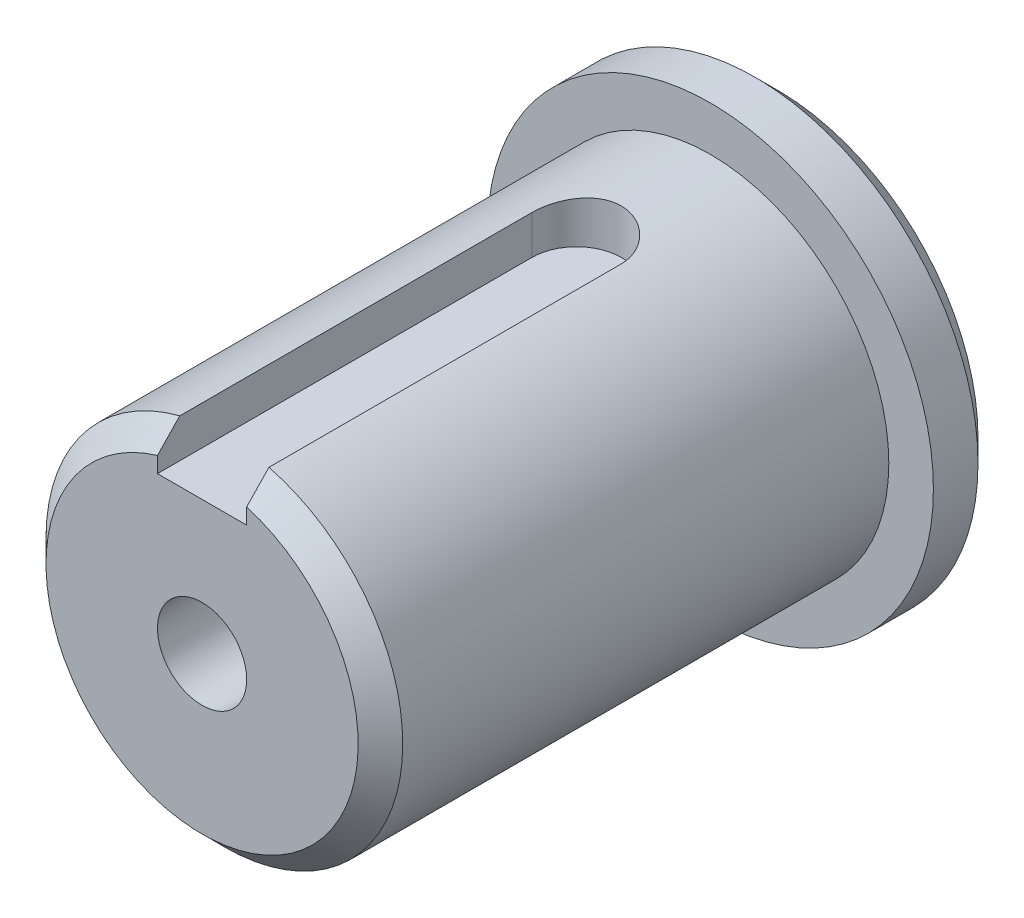
ISO-10303-21;
HEADER;
FILE_DESCRIPTION(('STEP AP214'),'2;1');
FILE_NAME('part.step','',(''),(''),'','','');
FILE_SCHEMA(('AUTOMOTIVE_DESIGN { 1 0 10303 214 1 1 1 1 }'));
ENDSEC;
DATA;
#1=APPLICATION_CONTEXT('core data for automotive mechanical design processes');
#2=APPLICATION_PROTOCOL_DEFINITION('international standard','automotive_design',2000,#1);
#3=PRODUCT_CONTEXT('',#1,'mechanical');
#4=PRODUCT('Part','Part','',(#3));
#5=PRODUCT_RELATED_PRODUCT_CATEGORY('part','',(#4));
#6=PRODUCT_DEFINITION_FORMATION('','',#4);
#7=PRODUCT_DEFINITION_CONTEXT('part definition',#1,'design');
#8=PRODUCT_DEFINITION('design','',#6,#7);
#9=PRODUCT_DEFINITION_SHAPE('','',#8);
#10=(LENGTH_UNIT() NAMED_UNIT(*) SI_UNIT(.MILLI.,.METRE.));
#11=(NAMED_UNIT(*) PLANE_ANGLE_UNIT() SI_UNIT($,.RADIAN.));
#12=(NAMED_UNIT(*) SI_UNIT($,.STERADIAN.) SOLID_ANGLE_UNIT());
#13=UNCERTAINTY_MEASURE_WITH_UNIT(LENGTH_MEASURE(1.E-05),#10,'distance_accuracy_value','');
#14=(GEOMETRIC_REPRESENTATION_CONTEXT(3) GLOBAL_UNCERTAINTY_ASSIGNED_CONTEXT((#13)) GLOBAL_UNIT_ASSIGNED_CONTEXT((#10,
#11,#12)) REPRESENTATION_CONTEXT('',''));
#15=CARTESIAN_POINT('',(0.,0.,0.));
#16=DIRECTION('',(0.,0.,1.));
#17=DIRECTION('',(1.,0.,0.));
#18=AXIS2_PLACEMENT_3D('',#15,#16,#17);
#19=CARTESIAN_POINT('',(0.,0.,0.));
#20=DIRECTION('',(0.,0.,1.));
#21=DIRECTION('',(1.,0.,0.));
#22=AXIS2_PLACEMENT_3D('',#19,#20,#21);
#23=CYLINDRICAL_SURFACE('',#22,2.5);
#24=CARTESIAN_POINT('',(0.,0.,0.));
#25=DIRECTION('',(0.,0.,1.));
#26=DIRECTION('',(1.,0.,0.));
#27=AXIS2_PLACEMENT_3D('',#24,#25,#26);
#28=CIRCLE('',#27,2.5);
#29=CARTESIAN_POINT('',(2.5,0.,0.));
#30=VERTEX_POINT('',#29);
#31=EDGE_CURVE('E110',#30,#30,#28,.T.);
#32=ORIENTED_EDGE('',*,*,#31,.F.);
#33=EDGE_LOOP('',(#32));
#34=FACE_BOUND('',#33,.T.);
#35=CARTESIAN_POINT('',(0.,0.,8.));
#36=DIRECTION('',(0.,0.,1.));
#37=DIRECTION('',(1.,0.,0.));
#38=AXIS2_PLACEMENT_3D('',#35,#36,#37);
#39=CIRCLE('',#38,2.5);
#40=CARTESIAN_POINT('',(2.5,0.,8.));
#41=VERTEX_POINT('',#40);
#42=EDGE_CURVE('E183',#41,#41,#39,.T.);
#43=ORIENTED_EDGE('',*,*,#42,.T.);
#44=EDGE_LOOP('',(#43));
#45=FACE_BOUND('',#44,.T.);
#46=ADVANCED_FACE('F45',(#34,#45),#23,.F.);
#47=CARTESIAN_POINT('',(0.,2.5,0.));
#48=DIRECTION('',(0.,0.,1.));
#49=DIRECTION('',(1.,0.,0.));
#50=AXIS2_PLACEMENT_3D('',#47,#48,#49);
#51=PLANE('',#50);
#52=CARTESIAN_POINT('',(0.,0.,0.));
#53=DIRECTION('',(0.,0.,1.));
#54=DIRECTION('',(1.,0.,0.));
#55=AXIS2_PLACEMENT_3D('',#52,#53,#54);
#56=CIRCLE('',#55,4.5);
#57=CARTESIAN_POINT('',(4.5,0.,0.));
#58=VERTEX_POINT('',#57);
#59=EDGE_CURVE('E211',#58,#58,#56,.T.);
#60=ORIENTED_EDGE('',*,*,#59,.F.);
#61=EDGE_LOOP('',(#60));
#62=FACE_BOUND('',#61,.T.);
#63=ORIENTED_EDGE('',*,*,#31,.T.);
#64=EDGE_LOOP('',(#63));
#65=FACE_BOUND('',#64,.T.);
#66=ADVANCED_FACE('F171',(#62,#65),#51,.F.);
#67=CARTESIAN_POINT('',(0.,0.,0.));
#68=DIRECTION('',(0.,0.,1.));
#69=DIRECTION('',(1.,0.,0.));
#70=AXIS2_PLACEMENT_3D('',#67,#68,#69);
#71=CONICAL_SURFACE('',#70,4.5,0.785398163397446);
#72=CARTESIAN_POINT('',(0.,0.,0.500000000000002));
#73=DIRECTION('',(0.,0.,1.));
#74=DIRECTION('',(1.,0.,0.));
#75=AXIS2_PLACEMENT_3D('',#72,#73,#74);
#76=CIRCLE('',#75,5.);
#77=CARTESIAN_POINT('',(5.,0.,0.500000000000002));
#78=VERTEX_POINT('',#77);
#79=EDGE_CURVE('E208',#78,#78,#76,.T.);
#80=ORIENTED_EDGE('',*,*,#79,.F.);
#81=EDGE_LOOP('',(#80));
#82=FACE_BOUND('',#81,.T.);
#83=ORIENTED_EDGE('',*,*,#59,.T.);
#84=EDGE_LOOP('',(#83));
#85=FACE_BOUND('',#84,.T.);
#86=ADVANCED_FACE('F176',(#82,#85),#71,.T.);
#87=CARTESIAN_POINT('',(0.,0.,0.));
#88=DIRECTION('',(0.,0.,1.));
#89=DIRECTION('',(1.,0.,0.));
#90=AXIS2_PLACEMENT_3D('',#87,#88,#89);
#91=CYLINDRICAL_SURFACE('',#90,5.);
#92=CARTESIAN_POINT('',(0.,0.,1.5));
#93=DIRECTION('',(0.,0.,1.));
#94=DIRECTION('',(1.,0.,0.));
#95=AXIS2_PLACEMENT_3D('',#92,#93,#94);
#96=CIRCLE('',#95,5.);
#97=CARTESIAN_POINT('',(5.,0.,1.5));
#98=VERTEX_POINT('',#97);
#99=EDGE_CURVE('E205',#98,#98,#96,.T.);
#100=ORIENTED_EDGE('',*,*,#99,.F.);
#101=EDGE_LOOP('',(#100));
#102=FACE_BOUND('',#101,.T.);
#103=ORIENTED_EDGE('',*,*,#79,.T.);
#104=EDGE_LOOP('',(#103));
#105=FACE_BOUND('',#104,.T.);
#106=ADVANCED_FACE('F218',(#102,#105),#91,.T.);
#107=CARTESIAN_POINT('',(0.,5.,1.5));
#108=DIRECTION('',(0.,0.,-1.));
#109=DIRECTION('',(-1.,0.,0.));
#110=AXIS2_PLACEMENT_3D('',#107,#108,#109);
#111=PLANE('',#110);
#112=CARTESIAN_POINT('',(0.,0.,1.5));
#113=DIRECTION('',(0.,0.,1.));
#114=DIRECTION('',(1.,0.,0.));
#115=AXIS2_PLACEMENT_3D('',#112,#113,#114);
#116=CIRCLE('',#115,4.);
#117=CARTESIAN_POINT('',(4.,0.,1.5));
#118=VERTEX_POINT('',#117);
#119=EDGE_CURVE('E202',#118,#118,#116,.T.);
#120=ORIENTED_EDGE('',*,*,#119,.F.);
#121=EDGE_LOOP('',(#120));
#122=FACE_BOUND('',#121,.T.);
#123=ORIENTED_EDGE('',*,*,#99,.T.);
#124=EDGE_LOOP('',(#123));
#125=FACE_BOUND('',#124,.T.);
#126=ADVANCED_FACE('F224',(#122,#125),#111,.F.);
#127=CARTESIAN_POINT('',(0.,0.,0.));
#128=DIRECTION('',(0.,0.,1.));
#129=DIRECTION('',(1.,0.,0.));
#130=AXIS2_PLACEMENT_3D('',#127,#128,#129);
#131=CYLINDRICAL_SURFACE('',#130,4.);
#132=CARTESIAN_POINT('',(0.,0.,12.4));
#133=DIRECTION('',(0.,0.,1.));
#134=DIRECTION('',(1.,0.,0.));
#135=AXIS2_PLACEMENT_3D('',#132,#133,#134);
#136=CIRCLE('',#135,4.);
#137=CARTESIAN_POINT('',(-1.,3.87298334620742,12.4));
#138=VERTEX_POINT('',#137);
#139=CARTESIAN_POINT('',(1.,3.87298334620742,12.4));
#140=VERTEX_POINT('',#139);
#141=EDGE_CURVE('E198',#138,#140,#136,.T.);
#142=ORIENTED_EDGE('',*,*,#141,.F.);
#143=DIRECTION('',(0.,0.,1.));
#144=VECTOR('',#143,1.);
#145=CARTESIAN_POINT('',(-1.,3.87298334620742,0.));
#146=LINE('',#145,#144);
#147=CARTESIAN_POINT('',(-1.,3.87298334620742,4.5));
#148=VERTEX_POINT('',#147);
#149=EDGE_CURVE('E74',#138,#148,#146,.F.);
#150=ORIENTED_EDGE('',*,*,#149,.T.);
#151=CARTESIAN_POINT('',(-1.,3.87298334620742,4.5));
#152=CARTESIAN_POINT('',(-1.00000033749611,3.87298148580177,4.47233701489346));
#153=CARTESIAN_POINT('',(-0.998851407375366,3.87328009949471,4.44468773698177));
#154=CARTESIAN_POINT('',(-0.994271295395754,3.87445904774559,4.38959596469644));
#155=CARTESIAN_POINT('',(-0.990840497572679,3.87533928441687,4.36215343631291));
#156=CARTESIAN_POINT('',(-0.977175239382526,3.87881710972054,4.28054682679115));
#157=CARTESIAN_POINT('',(-0.963567695172493,3.88225203148809,4.22694353151779));
#158=CARTESIAN_POINT('',(-0.927798076247996,3.89095422588003,4.12287532621803));
#159=CARTESIAN_POINT('',(-0.905636805423835,3.8962213263093,4.07241012178714));
#160=CARTESIAN_POINT('',(-0.853415378025865,3.90799134471939,3.97588855135267));
#161=CARTESIAN_POINT('',(-0.823353103356932,3.91449459395647,3.92983337210903));
#162=CARTESIAN_POINT('',(-0.755484471828068,3.92816262398025,3.8424561180939));
#163=CARTESIAN_POINT('',(-0.717537268783975,3.93533791028916,3.80124511375448));
#164=CARTESIAN_POINT('',(-0.635275780516229,3.94945104396193,3.72569791051729));
#165=CARTESIAN_POINT('',(-0.590960479478831,3.95638885322537,3.69136281053206));
#166=CARTESIAN_POINT('',(-0.49645689940169,3.96936182283248,3.63008899838135));
#167=CARTESIAN_POINT('',(-0.446195340334473,3.9753830468173,3.60326010401602));
#168=CARTESIAN_POINT('',(-0.341702590842918,3.98572346250589,3.55847526580329));
#169=CARTESIAN_POINT('',(-0.287472184083009,3.99004298914701,3.54051757570017));
#170=CARTESIAN_POINT('',(-0.17774410852516,3.99641900005128,3.51434100722257));
#171=CARTESIAN_POINT('',(-0.122294322002857,3.99851952901301,3.50593232757718));
#172=CARTESIAN_POINT('',(-0.010732775681679,4.00037438150815,3.4984966284567));
#173=CARTESIAN_POINT('',(0.0453789000287061,4.00012899993445,3.49946842980766));
#174=CARTESIAN_POINT('',(0.155352492972096,3.99735237365736,3.51062996368545));
#175=CARTESIAN_POINT('',(0.209236701739855,3.99487198677361,3.52061461659948));
#176=CARTESIAN_POINT('',(0.31453871108434,3.98796330636496,3.54918867918275));
#177=CARTESIAN_POINT('',(0.365956402423988,3.98353492665556,3.56777846956858));
#178=CARTESIAN_POINT('',(0.465407286024539,3.97314997761798,3.61320128067065));
#179=CARTESIAN_POINT('',(0.513405629602249,3.96717993827555,3.64010739423284));
#180=CARTESIAN_POINT('',(0.604276631230014,3.95435945541919,3.70134312983347));
#181=CARTESIAN_POINT('',(0.647148515562289,3.94750887933198,3.73567387025322));
#182=CARTESIAN_POINT('',(0.72776938970849,3.93345566022865,3.81187891208131));
#183=CARTESIAN_POINT('',(0.765349103054127,3.92624850477685,3.85393163653981));
#184=CARTESIAN_POINT('',(0.832969575186237,3.91246168284006,3.94382986692773));
#185=CARTESIAN_POINT('',(0.863008270245062,3.90588218842993,3.99167695328356));
#186=CARTESIAN_POINT('',(0.914804709285961,3.89407813586325,4.09214559782377));
#187=CARTESIAN_POINT('',(0.936517017887269,3.88886106009137,4.14479146489608));
#188=CARTESIAN_POINT('',(0.970702351849828,3.88047058807055,4.25311692841828));
#189=CARTESIAN_POINT('',(0.983189189212131,3.87729413761435,4.30879185514984));
#190=CARTESIAN_POINT('',(0.993904635150937,3.87455290681524,4.3874573807589));
#191=CARTESIAN_POINT('',(0.996190790966708,3.8739652311086,4.40991970321318));
#192=CARTESIAN_POINT('',(0.999236757697393,3.87318062488974,4.45491778990932));
#193=CARTESIAN_POINT('',(0.999999038096045,3.87298306219461,4.47745337595529));
#194=CARTESIAN_POINT('',(1.,3.87298334620742,4.5));
#195=B_SPLINE_CURVE_WITH_KNOTS('',3,(#151,#152,#153,#154,#155,#156,#157,#158,#159,#160,#161,
#162,#163,#164,#165,#166,#167,#168,#169,#170,#171,#172,#173,#174,#175,#176,#177,#178,#179,#180,
#181,#182,#183,#184,#185,#186,#187,#188,#189,#190,#191,#192,#193,#194),.UNSPECIFIED.,.F.,.F.,(4,
2,2,2,2,2,2,2,2,2,2,2,2,2,2,2,2,2,2,2,2,4),(0.,0.0829365303397684,0.16585910608465,
0.331229963080317,0.496585282091499,0.66198497472675,0.830641897427975,0.999325753539193,
1.17036187098235,1.34136430732424,1.50890481515325,1.67642426256639,1.84022545479275,
2.00403389475838,2.16932509450376,2.33464120964329,2.50441429534542,2.67423379180967,
2.84496720161068,3.01544447539986,3.08315848722648,3.15076267731671),.UNSPECIFIED.);
#196=CARTESIAN_POINT('',(1.,3.87298334620742,4.5));
#197=VERTEX_POINT('',#196);
#198=EDGE_CURVE('E11',#148,#197,#195,.T.);
#199=ORIENTED_EDGE('',*,*,#198,.T.);
#200=DIRECTION('',(0.,0.,1.));
#201=VECTOR('',#200,1.);
#202=CARTESIAN_POINT('',(1.,3.87298334620742,0.));
#203=LINE('',#202,#201);
#204=EDGE_CURVE('E142',#197,#140,#203,.T.);
#205=ORIENTED_EDGE('',*,*,#204,.T.);
#206=EDGE_LOOP('',(#142,#150,#199,#205));
#207=FACE_BOUND('',#206,.T.);
#208=ORIENTED_EDGE('',*,*,#119,.T.);
#209=EDGE_LOOP('',(#208));
#210=FACE_BOUND('',#209,.T.);
#211=ADVANCED_FACE('F167',(#207,#210),#131,.T.);
#212=CARTESIAN_POINT('',(0.,0.,12.4));
#213=DIRECTION('',(0.,0.,-1.));
#214=DIRECTION('',(-1.,0.,0.));
#215=AXIS2_PLACEMENT_3D('',#212,#213,#214);
#216=CONICAL_SURFACE('',#215,4.,0.785398163397447);
#217=CARTESIAN_POINT('',(0.,0.,12.9));
#218=DIRECTION('',(0.,0.,1.));
#219=DIRECTION('',(1.,0.,0.));
#220=AXIS2_PLACEMENT_3D('',#217,#218,#219);
#221=CIRCLE('',#220,3.5);
#222=CARTESIAN_POINT('',(-1.,3.35410196624968,12.9));
#223=VERTEX_POINT('',#222);
#224=CARTESIAN_POINT('',(1.,3.35410196624968,12.9));
#225=VERTEX_POINT('',#224);
#226=EDGE_CURVE('E124',#223,#225,#221,.T.);
#227=ORIENTED_EDGE('',*,*,#226,.F.);
#228=CARTESIAN_POINT('',(-1.,2.16166818275801,14.0182339887495));
#229=CARTESIAN_POINT('',(-1.,2.24778539076045,13.9400495264871));
#230=CARTESIAN_POINT('',(-1.,2.33351705427441,13.8614435994032));
#231=CARTESIAN_POINT('',(-1.,2.50436444075498,13.7035685916532));
#232=CARTESIAN_POINT('',(-1.,2.58948017752038,13.6242995259298));
#233=CARTESIAN_POINT('',(-1.,2.75925021712955,13.4652787003744));
#234=CARTESIAN_POINT('',(-1.,2.84390454418649,13.3855269663437));
#235=CARTESIAN_POINT('',(-1.,3.01285385337302,13.225642859283));
#236=CARTESIAN_POINT('',(-1.,3.09714883316616,13.1455104837853));
#237=CARTESIAN_POINT('',(-1.,3.34959667571459,12.9046839939829));
#238=CARTESIAN_POINT('',(-1.,3.51732685048182,12.743546962752));
#239=CARTESIAN_POINT('',(-1.,3.85204910097382,12.4205050338407));
#240=CARTESIAN_POINT('',(-1.,4.01904116674868,12.2586001258696));
#241=CARTESIAN_POINT('',(-1.,4.32504897303705,11.960968635175));
#242=CARTESIAN_POINT('',(-1.,4.46414270728864,11.8253221940053));
#243=CARTESIAN_POINT('',(-1.,4.74205519603328,11.5537394343798));
#244=CARTESIAN_POINT('',(-1.,4.88087394205808,11.4178031072566));
#245=CARTESIAN_POINT('',(-1.,5.01959352573439,11.2817660112501));
#246=B_SPLINE_CURVE_WITH_KNOTS('',3,(#228,#229,#230,#231,#232,#233,#234,#235,#236,#237,#238,
#239,#240,#241,#242,#243,#244,#245),.UNSPECIFIED.,.F.,.F.,(4,2,2,2,2,2,2,2,4),(0.,
0.348937994921588,0.697868148129732,1.04677981092494,1.39569373886185,2.09346225124986,
2.79124014123565,3.37409749189515,3.95697252096203),.UNSPECIFIED.);
#247=EDGE_CURVE('E192',#223,#138,#246,.T.);
#248=ORIENTED_EDGE('',*,*,#247,.T.);
#249=ORIENTED_EDGE('',*,*,#141,.T.);
#250=CARTESIAN_POINT('',(1.,5.01959352573439,11.2817660112501));
#251=CARTESIAN_POINT('',(1.,4.90188159818296,11.3972081766581));
#252=CARTESIAN_POINT('',(1.,4.78409405290292,11.5125730901077));
#253=CARTESIAN_POINT('',(1.,4.54832563402261,11.743106231456));
#254=CARTESIAN_POINT('',(1.,4.43034475955825,11.8582744584708));
#255=CARTESIAN_POINT('',(1.,4.07606767787835,12.2034026348856));
#256=CARTESIAN_POINT('',(1.,3.83941998825705,12.4330027996637));
#257=CARTESIAN_POINT('',(1.,3.4832529291617,12.7761812065402));
#258=CARTESIAN_POINT('',(1.,3.36432670743436,12.8903747539779));
#259=CARTESIAN_POINT('',(1.,3.12593585665128,13.1181962248205));
#260=CARTESIAN_POINT('',(1.,3.00647123362626,13.2318241545313));
#261=CARTESIAN_POINT('',(1.,2.76678976139718,13.458303300516));
#262=CARTESIAN_POINT('',(1.,2.6465728577209,13.5711544592724));
#263=CARTESIAN_POINT('',(1.,2.46543974132751,13.7395674372342));
#264=CARTESIAN_POINT('',(1.,2.40492627055208,13.7955621749514));
#265=CARTESIAN_POINT('',(1.,2.28356453649156,13.9071889545584));
#266=CARTESIAN_POINT('',(1.,2.22271626925536,13.9628209921507));
#267=CARTESIAN_POINT('',(1.,2.16166818275754,14.0182339887499));
#268=B_SPLINE_CURVE_WITH_KNOTS('',3,(#250,#251,#252,#253,#254,#255,#256,#257,#258,#259,#260,
#261,#262,#263,#264,#265,#266,#267),.UNSPECIFIED.,.F.,.F.,(4,2,2,2,2,2,2,2,4),(0.,
0.494617662763852,0.989237542258999,1.97840571649359,2.47302799783527,2.96764475253075,
3.46229774641327,3.70963348854709,3.95697215590979),.UNSPECIFIED.);
#269=EDGE_CURVE('E133',#140,#225,#268,.T.);
#270=ORIENTED_EDGE('',*,*,#269,.T.);
#271=EDGE_LOOP('',(#227,#248,#249,#270));
#272=FACE_BOUND('',#271,.T.);
#273=ADVANCED_FACE('F145',(#272),#216,.T.);
#274=CARTESIAN_POINT('',(0.,3.5,12.9));
#275=DIRECTION('',(0.,0.,-1.));
#276=DIRECTION('',(-1.,0.,0.));
#277=AXIS2_PLACEMENT_3D('',#274,#275,#276);
#278=PLANE('',#277);
#279=CARTESIAN_POINT('',(0.,0.,12.9));
#280=DIRECTION('',(0.,0.,1.));
#281=DIRECTION('',(1.,0.,0.));
#282=AXIS2_PLACEMENT_3D('',#279,#280,#281);
#283=CIRCLE('',#282,1.);
#284=CARTESIAN_POINT('',(1.,0.,12.9));
#285=VERTEX_POINT('',#284);
#286=EDGE_CURVE('E190',#285,#285,#283,.T.);
#287=ORIENTED_EDGE('',*,*,#286,.F.);
#288=EDGE_LOOP('',(#287));
#289=FACE_BOUND('',#288,.T.);
#290=DIRECTION('',(1.,0.,0.));
#291=VECTOR('',#290,1.);
#292=CARTESIAN_POINT('',(0.,3.,12.9));
#293=LINE('',#292,#291);
#294=CARTESIAN_POINT('',(-1.,3.,12.9));
#295=VERTEX_POINT('',#294);
#296=CARTESIAN_POINT('',(1.,3.,12.9));
#297=VERTEX_POINT('',#296);
#298=EDGE_CURVE('E59',#295,#297,#293,.T.);
#299=ORIENTED_EDGE('',*,*,#298,.F.);
#300=DIRECTION('',(0.,1.,0.));
#301=VECTOR('',#300,1.);
#302=CARTESIAN_POINT('',(-1.,3.,12.9));
#303=LINE('',#302,#301);
#304=EDGE_CURVE('E143',#295,#223,#303,.T.);
#305=ORIENTED_EDGE('',*,*,#304,.T.);
#306=ORIENTED_EDGE('',*,*,#226,.T.);
#307=DIRECTION('',(0.,1.,0.));
#308=VECTOR('',#307,1.);
#309=CARTESIAN_POINT('',(1.,3.,12.9));
#310=LINE('',#309,#308);
#311=EDGE_CURVE('E113',#297,#225,#310,.T.);
#312=ORIENTED_EDGE('',*,*,#311,.F.);
#313=EDGE_LOOP('',(#299,#305,#306,#312));
#314=FACE_BOUND('',#313,.T.);
#315=ADVANCED_FACE('F122',(#289,#314),#278,.F.);
#316=CARTESIAN_POINT('',(0.,0.,0.));
#317=DIRECTION('',(0.,0.,1.));
#318=DIRECTION('',(1.,0.,0.));
#319=AXIS2_PLACEMENT_3D('',#316,#317,#318);
#320=CYLINDRICAL_SURFACE('',#319,1.);
#321=CARTESIAN_POINT('',(0.,0.,8.));
#322=DIRECTION('',(0.,0.,1.));
#323=DIRECTION('',(1.,0.,0.));
#324=AXIS2_PLACEMENT_3D('',#321,#322,#323);
#325=CIRCLE('',#324,1.);
#326=CARTESIAN_POINT('',(1.,0.,8.));
#327=VERTEX_POINT('',#326);
#328=EDGE_CURVE('E185',#327,#327,#325,.T.);
#329=ORIENTED_EDGE('',*,*,#328,.F.);
#330=EDGE_LOOP('',(#329));
#331=FACE_BOUND('',#330,.T.);
#332=ORIENTED_EDGE('',*,*,#286,.T.);
#333=EDGE_LOOP('',(#332));
#334=FACE_BOUND('',#333,.T.);
#335=ADVANCED_FACE('F158',(#331,#334),#320,.F.);
#336=CARTESIAN_POINT('',(0.,1.,8.));
#337=DIRECTION('',(0.,0.,1.));
#338=DIRECTION('',(1.,0.,0.));
#339=AXIS2_PLACEMENT_3D('',#336,#337,#338);
#340=PLANE('',#339);
#341=ORIENTED_EDGE('',*,*,#42,.F.);
#342=EDGE_LOOP('',(#341));
#343=FACE_BOUND('',#342,.T.);
#344=ORIENTED_EDGE('',*,*,#328,.T.);
#345=EDGE_LOOP('',(#344));
#346=FACE_BOUND('',#345,.T.);
#347=ADVANCED_FACE('F155',(#343,#346),#340,.F.);
#348=CARTESIAN_POINT('',(0.,3.,4.5));
#349=DIRECTION('',(0.,1.,0.));
#350=DIRECTION('',(0.,0.,1.));
#351=AXIS2_PLACEMENT_3D('',#348,#349,#350);
#352=CYLINDRICAL_SURFACE('',#351,1.);
#353=DIRECTION('',(0.,1.,0.));
#354=VECTOR('',#353,1.);
#355=CARTESIAN_POINT('',(-1.,3.,4.5));
#356=LINE('',#355,#354);
#357=CARTESIAN_POINT('',(-1.,3.,4.5));
#358=VERTEX_POINT('',#357);
#359=EDGE_CURVE('E127',#358,#148,#356,.T.);
#360=ORIENTED_EDGE('',*,*,#359,.F.);
#361=CARTESIAN_POINT('',(0.,3.,4.5));
#362=DIRECTION('',(0.,1.,0.));
#363=DIRECTION('',(0.,0.,1.));
#364=AXIS2_PLACEMENT_3D('',#361,#362,#363);
#365=CIRCLE('',#364,1.);
#366=CARTESIAN_POINT('',(1.,3.,4.5));
#367=VERTEX_POINT('',#366);
#368=EDGE_CURVE('E119',#367,#358,#365,.T.);
#369=ORIENTED_EDGE('',*,*,#368,.F.);
#370=DIRECTION('',(0.,1.,0.));
#371=VECTOR('',#370,1.);
#372=CARTESIAN_POINT('',(1.,3.,4.5));
#373=LINE('',#372,#371);
#374=EDGE_CURVE('E116',#367,#197,#373,.T.);
#375=ORIENTED_EDGE('',*,*,#374,.T.);
#376=ORIENTED_EDGE('',*,*,#198,.F.);
#377=EDGE_LOOP('',(#360,#369,#375,#376));
#378=FACE_BOUND('',#377,.T.);
#379=ADVANCED_FACE('F152',(#378),#352,.F.);
#380=CARTESIAN_POINT('',(-1.,3.,12.9));
#381=DIRECTION('',(-1.,0.,0.));
#382=DIRECTION('',(0.,0.,1.));
#383=AXIS2_PLACEMENT_3D('',#380,#381,#382);
#384=PLANE('',#383);
#385=ORIENTED_EDGE('',*,*,#247,.F.);
#386=ORIENTED_EDGE('',*,*,#304,.F.);
#387=DIRECTION('',(0.,0.,1.));
#388=VECTOR('',#387,1.);
#389=CARTESIAN_POINT('',(-1.,3.,12.9));
#390=LINE('',#389,#388);
#391=EDGE_CURVE('E66',#358,#295,#390,.T.);
#392=ORIENTED_EDGE('',*,*,#391,.F.);
#393=ORIENTED_EDGE('',*,*,#359,.T.);
#394=ORIENTED_EDGE('',*,*,#149,.F.);
#395=EDGE_LOOP('',(#385,#386,#392,#393,#394));
#396=FACE_BOUND('',#395,.T.);
#397=ADVANCED_FACE('F151',(#396),#384,.F.);
#398=CARTESIAN_POINT('',(1.,3.,12.9));
#399=DIRECTION('',(1.,0.,0.));
#400=DIRECTION('',(0.,0.,-1.));
#401=AXIS2_PLACEMENT_3D('',#398,#399,#400);
#402=PLANE('',#401);
#403=ORIENTED_EDGE('',*,*,#374,.F.);
#404=DIRECTION('',(0.,0.,-1.));
#405=VECTOR('',#404,1.);
#406=CARTESIAN_POINT('',(1.,3.,12.9));
#407=LINE('',#406,#405);
#408=EDGE_CURVE('E106',#297,#367,#407,.T.);
#409=ORIENTED_EDGE('',*,*,#408,.F.);
#410=ORIENTED_EDGE('',*,*,#311,.T.);
#411=ORIENTED_EDGE('',*,*,#269,.F.);
#412=ORIENTED_EDGE('',*,*,#204,.F.);
#413=EDGE_LOOP('',(#403,#409,#410,#411,#412));
#414=FACE_BOUND('',#413,.T.);
#415=ADVANCED_FACE('F112',(#414),#402,.F.);
#416=CARTESIAN_POINT('',(0.,3.,12.9));
#417=DIRECTION('',(0.,1.,0.));
#418=DIRECTION('',(0.,0.,1.));
#419=AXIS2_PLACEMENT_3D('',#416,#417,#418);
#420=PLANE('',#419);
#421=ORIENTED_EDGE('',*,*,#298,.T.);
#422=ORIENTED_EDGE('',*,*,#408,.T.);
#423=ORIENTED_EDGE('',*,*,#368,.T.);
#424=ORIENTED_EDGE('',*,*,#391,.T.);
#425=EDGE_LOOP('',(#421,#422,#423,#424));
#426=FACE_BOUND('',#425,.T.);
#427=ADVANCED_FACE('F105',(#426),#420,.T.);
#428=CLOSED_SHELL('',(#46,#66,#86,#106,#126,#211,#273,#315,#335,#347,#379,#397,#415,#427));
#429=MANIFOLD_SOLID_BREP('B2',#428);
#430=ADVANCED_BREP_SHAPE_REPRESENTATION('',(#18,#429),#14);
#431=SHAPE_DEFINITION_REPRESENTATION(#9,#430);
ENDSEC;
END-ISO-10303-21;
